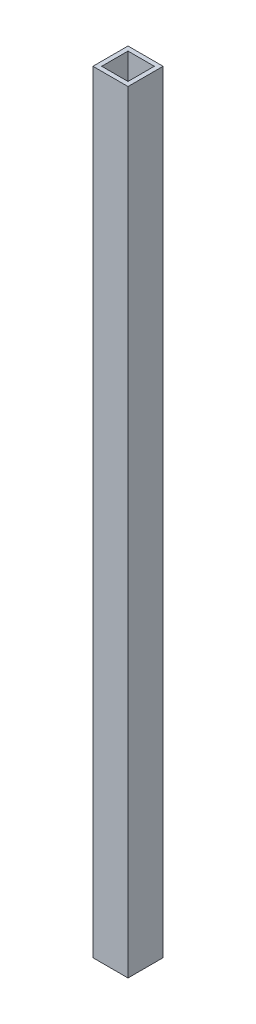
ISO-10303-21;
HEADER;
FILE_DESCRIPTION(('STEP AP214'),'2;1');
FILE_NAME('part.step','',(''),(''),'','','');
FILE_SCHEMA(('AUTOMOTIVE_DESIGN { 1 0 10303 214 1 1 1 1 }'));
ENDSEC;
DATA;
#1=APPLICATION_CONTEXT('core data for automotive mechanical design processes');
#2=APPLICATION_PROTOCOL_DEFINITION('international standard','automotive_design',2000,#1);
#3=PRODUCT_CONTEXT('',#1,'mechanical');
#4=PRODUCT('Part','Part','',(#3));
#5=PRODUCT_RELATED_PRODUCT_CATEGORY('part','',(#4));
#6=PRODUCT_DEFINITION_FORMATION('','',#4);
#7=PRODUCT_DEFINITION_CONTEXT('part definition',#1,'design');
#8=PRODUCT_DEFINITION('design','',#6,#7);
#9=PRODUCT_DEFINITION_SHAPE('','',#8);
#10=(LENGTH_UNIT() NAMED_UNIT(*) SI_UNIT(.MILLI.,.METRE.));
#11=(NAMED_UNIT(*) PLANE_ANGLE_UNIT() SI_UNIT($,.RADIAN.));
#12=(NAMED_UNIT(*) SI_UNIT($,.STERADIAN.) SOLID_ANGLE_UNIT());
#13=UNCERTAINTY_MEASURE_WITH_UNIT(LENGTH_MEASURE(1.E-05),#10,'distance_accuracy_value','');
#14=(GEOMETRIC_REPRESENTATION_CONTEXT(3) GLOBAL_UNCERTAINTY_ASSIGNED_CONTEXT((#13)) GLOBAL_UNIT_ASSIGNED_CONTEXT((#10,
#11,#12)) REPRESENTATION_CONTEXT('',''));
#15=CARTESIAN_POINT('',(0.,0.,0.));
#16=DIRECTION('',(0.,0.,1.));
#17=DIRECTION('',(1.,0.,0.));
#18=AXIS2_PLACEMENT_3D('',#15,#16,#17);
#19=CARTESIAN_POINT('',(0.,558.8,0.));
#20=DIRECTION('',(0.,1.,0.));
#21=DIRECTION('',(0.,0.,1.));
#22=AXIS2_PLACEMENT_3D('',#19,#20,#21);
#23=PLANE('',#22);
#24=DIRECTION('',(0.,0.,1.));
#25=VECTOR('',#24,1.);
#26=CARTESIAN_POINT('',(-12.7,558.8,-12.7));
#27=LINE('',#26,#25);
#28=CARTESIAN_POINT('',(-12.7,558.8,-12.7));
#29=VERTEX_POINT('',#28);
#30=CARTESIAN_POINT('',(-12.7,558.8,12.7));
#31=VERTEX_POINT('',#30);
#32=EDGE_CURVE('E134',#29,#31,#27,.T.);
#33=ORIENTED_EDGE('',*,*,#32,.T.);
#34=DIRECTION('',(1.,0.,0.));
#35=VECTOR('',#34,1.);
#36=CARTESIAN_POINT('',(-12.7,558.8,12.7));
#37=LINE('',#36,#35);
#38=CARTESIAN_POINT('',(12.7,558.8,12.7));
#39=VERTEX_POINT('',#38);
#40=EDGE_CURVE('E137',#31,#39,#37,.T.);
#41=ORIENTED_EDGE('',*,*,#40,.T.);
#42=DIRECTION('',(0.,0.,-1.));
#43=VECTOR('',#42,1.);
#44=CARTESIAN_POINT('',(12.7,558.8,-12.7));
#45=LINE('',#44,#43);
#46=CARTESIAN_POINT('',(12.7,558.8,-12.7));
#47=VERTEX_POINT('',#46);
#48=EDGE_CURVE('E140',#39,#47,#45,.T.);
#49=ORIENTED_EDGE('',*,*,#48,.T.);
#50=DIRECTION('',(-1.,0.,0.));
#51=VECTOR('',#50,1.);
#52=CARTESIAN_POINT('',(-12.7,558.8,-12.7));
#53=LINE('',#52,#51);
#54=EDGE_CURVE('E142',#47,#29,#53,.T.);
#55=ORIENTED_EDGE('',*,*,#54,.T.);
#56=EDGE_LOOP('',(#33,#41,#49,#55));
#57=FACE_BOUND('',#56,.T.);
#58=DIRECTION('',(1.,0.,0.));
#59=VECTOR('',#58,1.);
#60=CARTESIAN_POINT('',(-9.525,558.8,9.525));
#61=LINE('',#60,#59);
#62=CARTESIAN_POINT('',(-9.525,558.8,9.525));
#63=VERTEX_POINT('',#62);
#64=CARTESIAN_POINT('',(9.525,558.8,9.525));
#65=VERTEX_POINT('',#64);
#66=EDGE_CURVE('E106',#63,#65,#61,.T.);
#67=ORIENTED_EDGE('',*,*,#66,.F.);
#68=DIRECTION('',(0.,0.,1.));
#69=VECTOR('',#68,1.);
#70=CARTESIAN_POINT('',(-9.525,558.8,-9.525));
#71=LINE('',#70,#69);
#72=CARTESIAN_POINT('',(-9.525,558.8,-9.525));
#73=VERTEX_POINT('',#72);
#74=EDGE_CURVE('E98',#73,#63,#71,.T.);
#75=ORIENTED_EDGE('',*,*,#74,.F.);
#76=DIRECTION('',(-1.,0.,0.));
#77=VECTOR('',#76,1.);
#78=CARTESIAN_POINT('',(-9.525,558.8,-9.525));
#79=LINE('',#78,#77);
#80=CARTESIAN_POINT('',(9.525,558.8,-9.525));
#81=VERTEX_POINT('',#80);
#82=EDGE_CURVE('E120',#81,#73,#79,.T.);
#83=ORIENTED_EDGE('',*,*,#82,.F.);
#84=DIRECTION('',(0.,0.,-1.));
#85=VECTOR('',#84,1.);
#86=CARTESIAN_POINT('',(9.525,558.8,-9.525));
#87=LINE('',#86,#85);
#88=EDGE_CURVE('E118',#65,#81,#87,.T.);
#89=ORIENTED_EDGE('',*,*,#88,.F.);
#90=EDGE_LOOP('',(#67,#75,#83,#89));
#91=FACE_BOUND('',#90,.T.);
#92=ADVANCED_FACE('F33',(#57,#91),#23,.T.);
#93=CARTESIAN_POINT('',(0.,0.,0.));
#94=DIRECTION('',(0.,1.,0.));
#95=DIRECTION('',(0.,0.,1.));
#96=AXIS2_PLACEMENT_3D('',#93,#94,#95);
#97=PLANE('',#96);
#98=DIRECTION('',(0.,0.,1.));
#99=VECTOR('',#98,1.);
#100=CARTESIAN_POINT('',(-12.7,0.,-12.7));
#101=LINE('',#100,#99);
#102=CARTESIAN_POINT('',(-12.7,0.,-12.7));
#103=VERTEX_POINT('',#102);
#104=CARTESIAN_POINT('',(-12.7,0.,12.7));
#105=VERTEX_POINT('',#104);
#106=EDGE_CURVE('E114',#103,#105,#101,.T.);
#107=ORIENTED_EDGE('',*,*,#106,.F.);
#108=DIRECTION('',(-1.,0.,0.));
#109=VECTOR('',#108,1.);
#110=CARTESIAN_POINT('',(-12.7,0.,-12.7));
#111=LINE('',#110,#109);
#112=CARTESIAN_POINT('',(12.7,0.,-12.7));
#113=VERTEX_POINT('',#112);
#114=EDGE_CURVE('E138',#113,#103,#111,.T.);
#115=ORIENTED_EDGE('',*,*,#114,.F.);
#116=DIRECTION('',(0.,0.,-1.));
#117=VECTOR('',#116,1.);
#118=CARTESIAN_POINT('',(12.7,0.,-12.7));
#119=LINE('',#118,#117);
#120=CARTESIAN_POINT('',(12.7,0.,12.7));
#121=VERTEX_POINT('',#120);
#122=EDGE_CURVE('E149',#121,#113,#119,.T.);
#123=ORIENTED_EDGE('',*,*,#122,.F.);
#124=DIRECTION('',(1.,0.,0.));
#125=VECTOR('',#124,1.);
#126=CARTESIAN_POINT('',(-12.7,0.,12.7));
#127=LINE('',#126,#125);
#128=EDGE_CURVE('E147',#105,#121,#127,.T.);
#129=ORIENTED_EDGE('',*,*,#128,.F.);
#130=EDGE_LOOP('',(#107,#115,#123,#129));
#131=FACE_BOUND('',#130,.T.);
#132=DIRECTION('',(0.,0.,1.));
#133=VECTOR('',#132,1.);
#134=CARTESIAN_POINT('',(-9.525,0.,-9.525));
#135=LINE('',#134,#133);
#136=CARTESIAN_POINT('',(-9.525,0.,-9.525));
#137=VERTEX_POINT('',#136);
#138=CARTESIAN_POINT('',(-9.525,0.,9.525));
#139=VERTEX_POINT('',#138);
#140=EDGE_CURVE('E56',#137,#139,#135,.T.);
#141=ORIENTED_EDGE('',*,*,#140,.T.);
#142=DIRECTION('',(1.,0.,0.));
#143=VECTOR('',#142,1.);
#144=CARTESIAN_POINT('',(-9.525,0.,9.525));
#145=LINE('',#144,#143);
#146=CARTESIAN_POINT('',(9.525,0.,9.525));
#147=VERTEX_POINT('',#146);
#148=EDGE_CURVE('E113',#139,#147,#145,.T.);
#149=ORIENTED_EDGE('',*,*,#148,.T.);
#150=DIRECTION('',(0.,0.,-1.));
#151=VECTOR('',#150,1.);
#152=CARTESIAN_POINT('',(9.525,0.,-9.525));
#153=LINE('',#152,#151);
#154=CARTESIAN_POINT('',(9.525,0.,-9.525));
#155=VERTEX_POINT('',#154);
#156=EDGE_CURVE('E126',#147,#155,#153,.T.);
#157=ORIENTED_EDGE('',*,*,#156,.T.);
#158=DIRECTION('',(-1.,0.,0.));
#159=VECTOR('',#158,1.);
#160=CARTESIAN_POINT('',(-9.525,0.,-9.525));
#161=LINE('',#160,#159);
#162=EDGE_CURVE('E107',#155,#137,#161,.T.);
#163=ORIENTED_EDGE('',*,*,#162,.T.);
#164=EDGE_LOOP('',(#141,#149,#157,#163));
#165=FACE_BOUND('',#164,.T.);
#166=ADVANCED_FACE('F167',(#131,#165),#97,.F.);
#167=CARTESIAN_POINT('',(-12.7,558.8,-12.7));
#168=DIRECTION('',(1.,0.,0.));
#169=DIRECTION('',(0.,0.,-1.));
#170=AXIS2_PLACEMENT_3D('',#167,#168,#169);
#171=PLANE('',#170);
#172=ORIENTED_EDGE('',*,*,#106,.T.);
#173=DIRECTION('',(0.,-1.,0.));
#174=VECTOR('',#173,1.);
#175=CARTESIAN_POINT('',(-12.7,558.8,12.7));
#176=LINE('',#175,#174);
#177=EDGE_CURVE('E11',#31,#105,#176,.T.);
#178=ORIENTED_EDGE('',*,*,#177,.F.);
#179=ORIENTED_EDGE('',*,*,#32,.F.);
#180=DIRECTION('',(0.,-1.,0.));
#181=VECTOR('',#180,1.);
#182=CARTESIAN_POINT('',(-12.7,558.8,-12.7));
#183=LINE('',#182,#181);
#184=EDGE_CURVE('E144',#29,#103,#183,.T.);
#185=ORIENTED_EDGE('',*,*,#184,.T.);
#186=EDGE_LOOP('',(#172,#178,#179,#185));
#187=FACE_BOUND('',#186,.T.);
#188=ADVANCED_FACE('F35',(#187),#171,.F.);
#189=CARTESIAN_POINT('',(-12.7,558.8,12.7));
#190=DIRECTION('',(0.,0.,-1.));
#191=DIRECTION('',(-1.,0.,0.));
#192=AXIS2_PLACEMENT_3D('',#189,#190,#191);
#193=PLANE('',#192);
#194=ORIENTED_EDGE('',*,*,#128,.T.);
#195=DIRECTION('',(0.,-1.,0.));
#196=VECTOR('',#195,1.);
#197=CARTESIAN_POINT('',(12.7,558.8,12.7));
#198=LINE('',#197,#196);
#199=EDGE_CURVE('E41',#39,#121,#198,.T.);
#200=ORIENTED_EDGE('',*,*,#199,.F.);
#201=ORIENTED_EDGE('',*,*,#40,.F.);
#202=ORIENTED_EDGE('',*,*,#177,.T.);
#203=EDGE_LOOP('',(#194,#200,#201,#202));
#204=FACE_BOUND('',#203,.T.);
#205=ADVANCED_FACE('F177',(#204),#193,.F.);
#206=CARTESIAN_POINT('',(12.7,558.8,-12.7));
#207=DIRECTION('',(-1.,0.,0.));
#208=DIRECTION('',(0.,0.,1.));
#209=AXIS2_PLACEMENT_3D('',#206,#207,#208);
#210=PLANE('',#209);
#211=ORIENTED_EDGE('',*,*,#122,.T.);
#212=DIRECTION('',(0.,-1.,0.));
#213=VECTOR('',#212,1.);
#214=CARTESIAN_POINT('',(12.7,558.8,-12.7));
#215=LINE('',#214,#213);
#216=EDGE_CURVE('E154',#47,#113,#215,.T.);
#217=ORIENTED_EDGE('',*,*,#216,.F.);
#218=ORIENTED_EDGE('',*,*,#48,.F.);
#219=ORIENTED_EDGE('',*,*,#199,.T.);
#220=EDGE_LOOP('',(#211,#217,#218,#219));
#221=FACE_BOUND('',#220,.T.);
#222=ADVANCED_FACE('F161',(#221),#210,.F.);
#223=CARTESIAN_POINT('',(-12.7,558.8,-12.7));
#224=DIRECTION('',(0.,0.,1.));
#225=DIRECTION('',(1.,0.,0.));
#226=AXIS2_PLACEMENT_3D('',#223,#224,#225);
#227=PLANE('',#226);
#228=ORIENTED_EDGE('',*,*,#114,.T.);
#229=ORIENTED_EDGE('',*,*,#184,.F.);
#230=ORIENTED_EDGE('',*,*,#54,.F.);
#231=ORIENTED_EDGE('',*,*,#216,.T.);
#232=EDGE_LOOP('',(#228,#229,#230,#231));
#233=FACE_BOUND('',#232,.T.);
#234=ADVANCED_FACE('F171',(#233),#227,.F.);
#235=CARTESIAN_POINT('',(-9.525,558.8,-9.525));
#236=DIRECTION('',(1.,0.,0.));
#237=DIRECTION('',(0.,0.,-1.));
#238=AXIS2_PLACEMENT_3D('',#235,#236,#237);
#239=PLANE('',#238);
#240=ORIENTED_EDGE('',*,*,#140,.F.);
#241=DIRECTION('',(0.,-1.,0.));
#242=VECTOR('',#241,1.);
#243=CARTESIAN_POINT('',(-9.525,558.8,-9.525));
#244=LINE('',#243,#242);
#245=EDGE_CURVE('E102',#73,#137,#244,.T.);
#246=ORIENTED_EDGE('',*,*,#245,.F.);
#247=ORIENTED_EDGE('',*,*,#74,.T.);
#248=DIRECTION('',(0.,-1.,0.));
#249=VECTOR('',#248,1.);
#250=CARTESIAN_POINT('',(-9.525,558.8,9.525));
#251=LINE('',#250,#249);
#252=EDGE_CURVE('E101',#63,#139,#251,.T.);
#253=ORIENTED_EDGE('',*,*,#252,.T.);
#254=EDGE_LOOP('',(#240,#246,#247,#253));
#255=FACE_BOUND('',#254,.T.);
#256=ADVANCED_FACE('F100',(#255),#239,.T.);
#257=CARTESIAN_POINT('',(-9.525,558.8,9.525));
#258=DIRECTION('',(0.,0.,-1.));
#259=DIRECTION('',(-1.,0.,0.));
#260=AXIS2_PLACEMENT_3D('',#257,#258,#259);
#261=PLANE('',#260);
#262=ORIENTED_EDGE('',*,*,#148,.F.);
#263=ORIENTED_EDGE('',*,*,#252,.F.);
#264=ORIENTED_EDGE('',*,*,#66,.T.);
#265=DIRECTION('',(0.,-1.,0.));
#266=VECTOR('',#265,1.);
#267=CARTESIAN_POINT('',(9.525,558.8,9.525));
#268=LINE('',#267,#266);
#269=EDGE_CURVE('E115',#65,#147,#268,.T.);
#270=ORIENTED_EDGE('',*,*,#269,.T.);
#271=EDGE_LOOP('',(#262,#263,#264,#270));
#272=FACE_BOUND('',#271,.T.);
#273=ADVANCED_FACE('F110',(#272),#261,.T.);
#274=CARTESIAN_POINT('',(9.525,558.8,-9.525));
#275=DIRECTION('',(-1.,0.,0.));
#276=DIRECTION('',(0.,0.,1.));
#277=AXIS2_PLACEMENT_3D('',#274,#275,#276);
#278=PLANE('',#277);
#279=ORIENTED_EDGE('',*,*,#156,.F.);
#280=ORIENTED_EDGE('',*,*,#269,.F.);
#281=ORIENTED_EDGE('',*,*,#88,.T.);
#282=DIRECTION('',(0.,-1.,0.));
#283=VECTOR('',#282,1.);
#284=CARTESIAN_POINT('',(9.525,558.8,-9.525));
#285=LINE('',#284,#283);
#286=EDGE_CURVE('E48',#81,#155,#285,.T.);
#287=ORIENTED_EDGE('',*,*,#286,.T.);
#288=EDGE_LOOP('',(#279,#280,#281,#287));
#289=FACE_BOUND('',#288,.T.);
#290=ADVANCED_FACE('F200',(#289),#278,.T.);
#291=CARTESIAN_POINT('',(-9.525,558.8,-9.525));
#292=DIRECTION('',(0.,0.,1.));
#293=DIRECTION('',(1.,0.,0.));
#294=AXIS2_PLACEMENT_3D('',#291,#292,#293);
#295=PLANE('',#294);
#296=ORIENTED_EDGE('',*,*,#162,.F.);
#297=ORIENTED_EDGE('',*,*,#286,.F.);
#298=ORIENTED_EDGE('',*,*,#82,.T.);
#299=ORIENTED_EDGE('',*,*,#245,.T.);
#300=EDGE_LOOP('',(#296,#297,#298,#299));
#301=FACE_BOUND('',#300,.T.);
#302=ADVANCED_FACE('F204',(#301),#295,.T.);
#303=CLOSED_SHELL('',(#92,#166,#188,#205,#222,#234,#256,#273,#290,#302));
#304=MANIFOLD_SOLID_BREP('B2',#303);
#305=ADVANCED_BREP_SHAPE_REPRESENTATION('',(#18,#304),#14);
#306=SHAPE_DEFINITION_REPRESENTATION(#9,#305);
ENDSEC;
END-ISO-10303-21;
